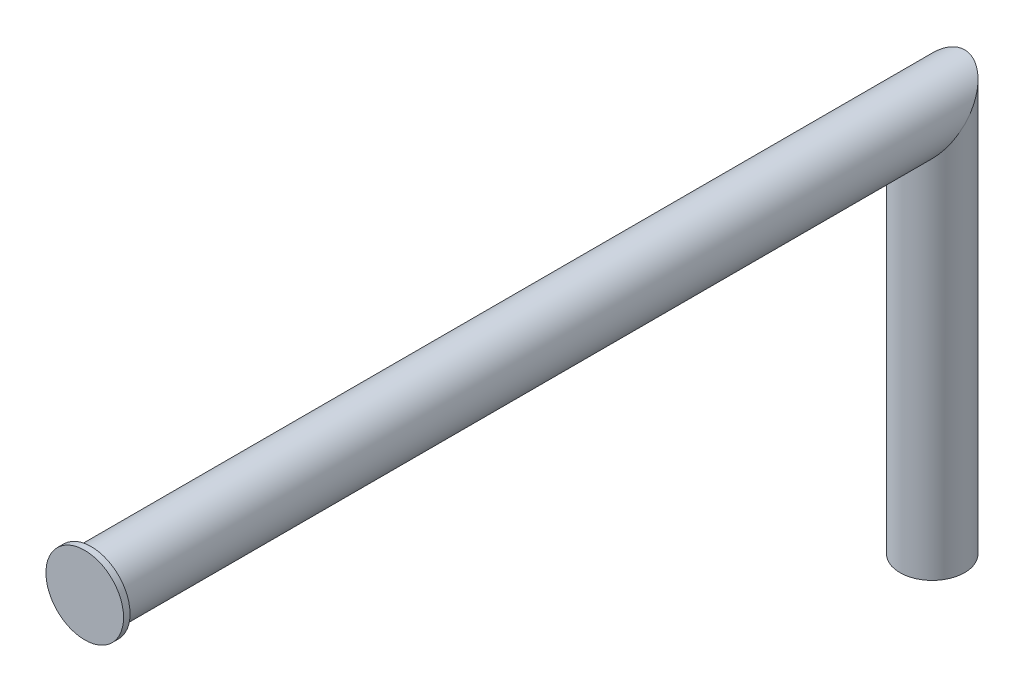
ISO-10303-21;
HEADER;
FILE_DESCRIPTION(('STEP AP214'),'2;1');
FILE_NAME('part.step','',(''),(''),'','','');
FILE_SCHEMA(('AUTOMOTIVE_DESIGN { 1 0 10303 214 1 1 1 1 }'));
ENDSEC;
DATA;
#1=APPLICATION_CONTEXT('core data for automotive mechanical design processes');
#2=APPLICATION_PROTOCOL_DEFINITION('international standard','automotive_design',2000,#1);
#3=PRODUCT_CONTEXT('',#1,'mechanical');
#4=PRODUCT('Part','Part','',(#3));
#5=PRODUCT_RELATED_PRODUCT_CATEGORY('part','',(#4));
#6=PRODUCT_DEFINITION_FORMATION('','',#4);
#7=PRODUCT_DEFINITION_CONTEXT('part definition',#1,'design');
#8=PRODUCT_DEFINITION('design','',#6,#7);
#9=PRODUCT_DEFINITION_SHAPE('','',#8);
#10=(LENGTH_UNIT() NAMED_UNIT(*) SI_UNIT(.MILLI.,.METRE.));
#11=(NAMED_UNIT(*) PLANE_ANGLE_UNIT() SI_UNIT($,.RADIAN.));
#12=(NAMED_UNIT(*) SI_UNIT($,.STERADIAN.) SOLID_ANGLE_UNIT());
#13=UNCERTAINTY_MEASURE_WITH_UNIT(LENGTH_MEASURE(1.E-05),#10,'distance_accuracy_value','');
#14=(GEOMETRIC_REPRESENTATION_CONTEXT(3) GLOBAL_UNCERTAINTY_ASSIGNED_CONTEXT((#13)) GLOBAL_UNIT_ASSIGNED_CONTEXT((#10,
#11,#12)) REPRESENTATION_CONTEXT('',''));
#15=CARTESIAN_POINT('',(0.,0.,0.));
#16=DIRECTION('',(0.,0.,1.));
#17=DIRECTION('',(1.,0.,0.));
#18=AXIS2_PLACEMENT_3D('',#15,#16,#17);
#19=CARTESIAN_POINT('',(0.,0.,-330.2));
#20=DIRECTION('',(0.,-1.,0.));
#21=DIRECTION('',(0.,0.,-1.));
#22=AXIS2_PLACEMENT_3D('',#19,#20,#21);
#23=CYLINDRICAL_SURFACE('',#22,12.7);
#24=CARTESIAN_POINT('',(0.,0.,-330.2));
#25=DIRECTION('',(0.,-0.707106781186548,-0.707106781186548));
#26=DIRECTION('',(0.,-0.707106781186548,0.707106781186548));
#27=AXIS2_PLACEMENT_3D('',#24,#25,#26);
#28=ELLIPSE('',#27,17.9605122421383,12.7);
#29=CARTESIAN_POINT('',(0.,-12.7,-317.5));
#30=VERTEX_POINT('',#29);
#31=EDGE_CURVE('E38',#30,#30,#28,.F.);
#32=ORIENTED_EDGE('',*,*,#31,.F.);
#33=EDGE_LOOP('',(#32));
#34=FACE_BOUND('',#33,.T.);
#35=CARTESIAN_POINT('',(0.,-152.4,-330.2));
#36=DIRECTION('',(0.,-1.,0.));
#37=DIRECTION('',(0.,0.,-1.));
#38=AXIS2_PLACEMENT_3D('',#35,#36,#37);
#39=CIRCLE('',#38,12.7);
#40=CARTESIAN_POINT('',(0.,-152.4,-342.9));
#41=VERTEX_POINT('',#40);
#42=EDGE_CURVE('E11',#41,#41,#39,.T.);
#43=ORIENTED_EDGE('',*,*,#42,.F.);
#44=EDGE_LOOP('',(#43));
#45=FACE_BOUND('',#44,.T.);
#46=ADVANCED_FACE('F32',(#34,#45),#23,.T.);
#47=CARTESIAN_POINT('',(0.,0.,-366.121024484277));
#48=DIRECTION('',(0.,0.,1.));
#49=DIRECTION('',(1.,0.,0.));
#50=AXIS2_PLACEMENT_3D('',#47,#48,#49);
#51=CYLINDRICAL_SURFACE('',#50,12.7);
#52=CARTESIAN_POINT('',(0.,0.,0.));
#53=DIRECTION('',(0.,0.,1.));
#54=DIRECTION('',(1.,0.,0.));
#55=AXIS2_PLACEMENT_3D('',#52,#53,#54);
#56=CIRCLE('',#55,12.7);
#57=CARTESIAN_POINT('',(12.7,0.,0.));
#58=VERTEX_POINT('',#57);
#59=EDGE_CURVE('E42',#58,#58,#56,.T.);
#60=ORIENTED_EDGE('',*,*,#59,.F.);
#61=EDGE_LOOP('',(#60));
#62=FACE_BOUND('',#61,.T.);
#63=ORIENTED_EDGE('',*,*,#31,.T.);
#64=EDGE_LOOP('',(#63));
#65=FACE_BOUND('',#64,.T.);
#66=ADVANCED_FACE('F73',(#62,#65),#51,.T.);
#67=CARTESIAN_POINT('',(0.,-152.4,-330.2));
#68=DIRECTION('',(0.,-1.,0.));
#69=DIRECTION('',(0.,0.,-1.));
#70=AXIS2_PLACEMENT_3D('',#67,#68,#69);
#71=PLANE('',#70);
#72=ORIENTED_EDGE('',*,*,#42,.T.);
#73=EDGE_LOOP('',(#72));
#74=FACE_BOUND('',#73,.T.);
#75=ADVANCED_FACE('F60',(#74),#71,.T.);
#76=CARTESIAN_POINT('',(0.,0.,2.54));
#77=DIRECTION('',(0.,0.,-1.));
#78=DIRECTION('',(-1.,0.,0.));
#79=AXIS2_PLACEMENT_3D('',#76,#77,#78);
#80=CYLINDRICAL_SURFACE('',#79,15.24);
#81=CARTESIAN_POINT('',(0.,0.,2.54));
#82=DIRECTION('',(0.,0.,1.));
#83=DIRECTION('',(1.,0.,0.));
#84=AXIS2_PLACEMENT_3D('',#81,#82,#83);
#85=CIRCLE('',#84,15.24);
#86=CARTESIAN_POINT('',(15.24,0.,2.54));
#87=VERTEX_POINT('',#86);
#88=EDGE_CURVE('E46',#87,#87,#85,.T.);
#89=ORIENTED_EDGE('',*,*,#88,.F.);
#90=EDGE_LOOP('',(#89));
#91=FACE_BOUND('',#90,.T.);
#92=CARTESIAN_POINT('',(0.,0.,0.));
#93=DIRECTION('',(0.,0.,1.));
#94=DIRECTION('',(1.,0.,0.));
#95=AXIS2_PLACEMENT_3D('',#92,#93,#94);
#96=CIRCLE('',#95,15.24);
#97=CARTESIAN_POINT('',(15.24,0.,0.));
#98=VERTEX_POINT('',#97);
#99=EDGE_CURVE('E49',#98,#98,#96,.T.);
#100=ORIENTED_EDGE('',*,*,#99,.T.);
#101=EDGE_LOOP('',(#100));
#102=FACE_BOUND('',#101,.T.);
#103=ADVANCED_FACE('F57',(#91,#102),#80,.T.);
#104=CARTESIAN_POINT('',(0.,0.,2.54));
#105=DIRECTION('',(0.,0.,1.));
#106=DIRECTION('',(1.,0.,0.));
#107=AXIS2_PLACEMENT_3D('',#104,#105,#106);
#108=PLANE('',#107);
#109=ORIENTED_EDGE('',*,*,#88,.T.);
#110=EDGE_LOOP('',(#109));
#111=FACE_BOUND('',#110,.T.);
#112=ADVANCED_FACE('F55',(#111),#108,.T.);
#113=CARTESIAN_POINT('',(0.,0.,0.));
#114=DIRECTION('',(0.,0.,1.));
#115=DIRECTION('',(1.,0.,0.));
#116=AXIS2_PLACEMENT_3D('',#113,#114,#115);
#117=PLANE('',#116);
#118=ORIENTED_EDGE('',*,*,#59,.T.);
#119=EDGE_LOOP('',(#118));
#120=FACE_BOUND('',#119,.T.);
#121=ORIENTED_EDGE('',*,*,#99,.F.);
#122=EDGE_LOOP('',(#121));
#123=FACE_BOUND('',#122,.T.);
#124=ADVANCED_FACE('F64',(#120,#123),#117,.F.);
#125=CLOSED_SHELL('',(#46,#66,#75,#103,#112,#124));
#126=MANIFOLD_SOLID_BREP('B2',#125);
#127=ADVANCED_BREP_SHAPE_REPRESENTATION('',(#18,#126),#14);
#128=SHAPE_DEFINITION_REPRESENTATION(#9,#127);
ENDSEC;
END-ISO-10303-21;
